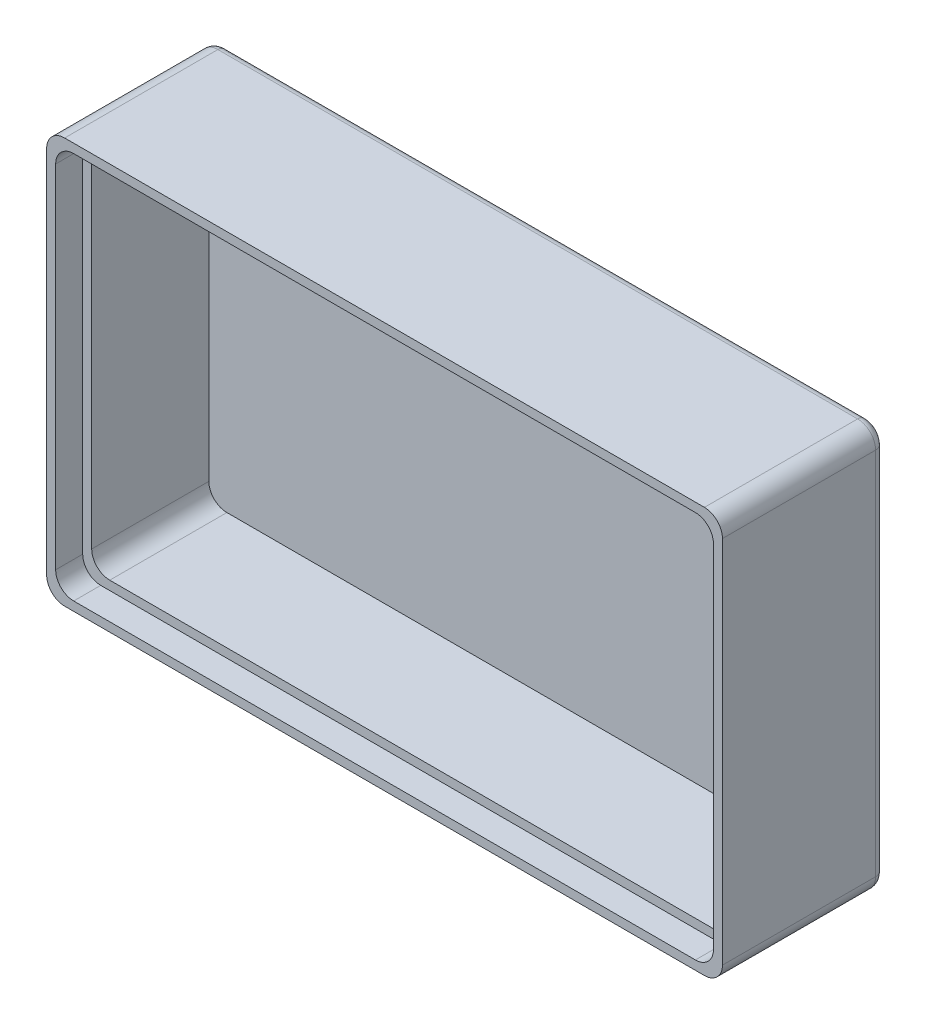
ISO-10303-21;
HEADER;
FILE_DESCRIPTION(('STEP AP214'),'2;1');
FILE_NAME('part.step','',(''),(''),'','','');
FILE_SCHEMA(('AUTOMOTIVE_DESIGN { 1 0 10303 214 1 1 1 1 }'));
ENDSEC;
DATA;
#1=APPLICATION_CONTEXT('core data for automotive mechanical design processes');
#2=APPLICATION_PROTOCOL_DEFINITION('international standard','automotive_design',2000,#1);
#3=PRODUCT_CONTEXT('',#1,'mechanical');
#4=PRODUCT('Part','Part','',(#3));
#5=PRODUCT_RELATED_PRODUCT_CATEGORY('part','',(#4));
#6=PRODUCT_DEFINITION_FORMATION('','',#4);
#7=PRODUCT_DEFINITION_CONTEXT('part definition',#1,'design');
#8=PRODUCT_DEFINITION('design','',#6,#7);
#9=PRODUCT_DEFINITION_SHAPE('','',#8);
#10=(LENGTH_UNIT() NAMED_UNIT(*) SI_UNIT(.MILLI.,.METRE.));
#11=(NAMED_UNIT(*) PLANE_ANGLE_UNIT() SI_UNIT($,.RADIAN.));
#12=(NAMED_UNIT(*) SI_UNIT($,.STERADIAN.) SOLID_ANGLE_UNIT());
#13=UNCERTAINTY_MEASURE_WITH_UNIT(LENGTH_MEASURE(1.E-05),#10,'distance_accuracy_value','');
#14=(GEOMETRIC_REPRESENTATION_CONTEXT(3) GLOBAL_UNCERTAINTY_ASSIGNED_CONTEXT((#13)) GLOBAL_UNIT_ASSIGNED_CONTEXT((#10,
#11,#12)) REPRESENTATION_CONTEXT('',''));
#15=CARTESIAN_POINT('',(0.,0.,0.));
#16=DIRECTION('',(0.,0.,1.));
#17=DIRECTION('',(1.,0.,0.));
#18=AXIS2_PLACEMENT_3D('',#15,#16,#17);
#19=CARTESIAN_POINT('',(-37.5,22.5,18.));
#20=DIRECTION('',(1.,0.,0.));
#21=DIRECTION('',(0.,1.,0.));
#22=AXIS2_PLACEMENT_3D('',#19,#20,#21);
#23=PLANE('',#22);
#24=DIRECTION('',(0.,0.,-1.));
#25=VECTOR('',#24,1.);
#26=CARTESIAN_POINT('',(-37.5,20.5,18.));
#27=LINE('',#26,#25);
#28=CARTESIAN_POINT('',(-37.5,20.5,18.));
#29=VERTEX_POINT('',#28);
#30=CARTESIAN_POINT('',(-37.5,20.5,1.));
#31=VERTEX_POINT('',#30);
#32=EDGE_CURVE('E365',#29,#31,#27,.T.);
#33=ORIENTED_EDGE('',*,*,#32,.T.);
#34=DIRECTION('',(0.,-1.,0.));
#35=VECTOR('',#34,1.);
#36=CARTESIAN_POINT('',(-37.5,22.5,1.));
#37=LINE('',#36,#35);
#38=CARTESIAN_POINT('',(-37.5,-20.5,1.));
#39=VERTEX_POINT('',#38);
#40=EDGE_CURVE('E62',#31,#39,#37,.T.);
#41=ORIENTED_EDGE('',*,*,#40,.T.);
#42=DIRECTION('',(0.,0.,-1.));
#43=VECTOR('',#42,1.);
#44=CARTESIAN_POINT('',(-37.5,-20.5,18.));
#45=LINE('',#44,#43);
#46=CARTESIAN_POINT('',(-37.5,-20.5,18.));
#47=VERTEX_POINT('',#46);
#48=EDGE_CURVE('E367',#39,#47,#45,.F.);
#49=ORIENTED_EDGE('',*,*,#48,.T.);
#50=DIRECTION('',(0.,-1.,0.));
#51=VECTOR('',#50,1.);
#52=CARTESIAN_POINT('',(-37.5,22.5,18.));
#53=LINE('',#52,#51);
#54=EDGE_CURVE('E299',#29,#47,#53,.T.);
#55=ORIENTED_EDGE('',*,*,#54,.F.);
#56=EDGE_LOOP('',(#33,#41,#49,#55));
#57=FACE_BOUND('',#56,.T.);
#58=ADVANCED_FACE('F38',(#57),#23,.F.);
#59=CARTESIAN_POINT('',(-37.5,-22.5,18.));
#60=DIRECTION('',(0.,1.,0.));
#61=DIRECTION('',(0.,0.,1.));
#62=AXIS2_PLACEMENT_3D('',#59,#60,#61);
#63=PLANE('',#62);
#64=DIRECTION('',(0.,0.,-1.));
#65=VECTOR('',#64,1.);
#66=CARTESIAN_POINT('',(-35.5,-22.5,18.));
#67=LINE('',#66,#65);
#68=CARTESIAN_POINT('',(-35.5,-22.5,18.));
#69=VERTEX_POINT('',#68);
#70=CARTESIAN_POINT('',(-35.5,-22.5,1.));
#71=VERTEX_POINT('',#70);
#72=EDGE_CURVE('E363',#69,#71,#67,.T.);
#73=ORIENTED_EDGE('',*,*,#72,.T.);
#74=DIRECTION('',(1.,0.,0.));
#75=VECTOR('',#74,1.);
#76=CARTESIAN_POINT('',(-37.5,-22.5,1.));
#77=LINE('',#76,#75);
#78=CARTESIAN_POINT('',(35.5,-22.5,1.));
#79=VERTEX_POINT('',#78);
#80=EDGE_CURVE('E11',#71,#79,#77,.T.);
#81=ORIENTED_EDGE('',*,*,#80,.T.);
#82=DIRECTION('',(0.,0.,-1.));
#83=VECTOR('',#82,1.);
#84=CARTESIAN_POINT('',(35.5,-22.5,18.));
#85=LINE('',#84,#83);
#86=CARTESIAN_POINT('',(35.5,-22.5,18.));
#87=VERTEX_POINT('',#86);
#88=EDGE_CURVE('E361',#79,#87,#85,.F.);
#89=ORIENTED_EDGE('',*,*,#88,.T.);
#90=DIRECTION('',(1.,0.,0.));
#91=VECTOR('',#90,1.);
#92=CARTESIAN_POINT('',(-37.5,-22.5,18.));
#93=LINE('',#92,#91);
#94=EDGE_CURVE('E302',#69,#87,#93,.T.);
#95=ORIENTED_EDGE('',*,*,#94,.F.);
#96=EDGE_LOOP('',(#73,#81,#89,#95));
#97=FACE_BOUND('',#96,.T.);
#98=ADVANCED_FACE('F468',(#97),#63,.F.);
#99=CARTESIAN_POINT('',(37.5,22.5,18.));
#100=DIRECTION('',(-1.,0.,0.));
#101=DIRECTION('',(0.,-1.,0.));
#102=AXIS2_PLACEMENT_3D('',#99,#100,#101);
#103=PLANE('',#102);
#104=DIRECTION('',(0.,0.,-1.));
#105=VECTOR('',#104,1.);
#106=CARTESIAN_POINT('',(37.5,-20.5,18.));
#107=LINE('',#106,#105);
#108=CARTESIAN_POINT('',(37.5,-20.5,18.));
#109=VERTEX_POINT('',#108);
#110=CARTESIAN_POINT('',(37.5,-20.5,1.));
#111=VERTEX_POINT('',#110);
#112=EDGE_CURVE('E379',#109,#111,#107,.T.);
#113=ORIENTED_EDGE('',*,*,#112,.T.);
#114=DIRECTION('',(0.,1.,0.));
#115=VECTOR('',#114,1.);
#116=CARTESIAN_POINT('',(37.5,22.5,1.));
#117=LINE('',#116,#115);
#118=CARTESIAN_POINT('',(37.5,20.5,1.));
#119=VERTEX_POINT('',#118);
#120=EDGE_CURVE('E418',#111,#119,#117,.T.);
#121=ORIENTED_EDGE('',*,*,#120,.T.);
#122=DIRECTION('',(0.,0.,-1.));
#123=VECTOR('',#122,1.);
#124=CARTESIAN_POINT('',(37.5,20.5,18.));
#125=LINE('',#124,#123);
#126=CARTESIAN_POINT('',(37.5,20.5,18.));
#127=VERTEX_POINT('',#126);
#128=EDGE_CURVE('E377',#119,#127,#125,.F.);
#129=ORIENTED_EDGE('',*,*,#128,.T.);
#130=DIRECTION('',(0.,1.,0.));
#131=VECTOR('',#130,1.);
#132=CARTESIAN_POINT('',(37.5,22.5,18.));
#133=LINE('',#132,#131);
#134=EDGE_CURVE('E305',#109,#127,#133,.T.);
#135=ORIENTED_EDGE('',*,*,#134,.F.);
#136=EDGE_LOOP('',(#113,#121,#129,#135));
#137=FACE_BOUND('',#136,.T.);
#138=ADVANCED_FACE('F486',(#137),#103,.F.);
#139=CARTESIAN_POINT('',(-37.5,22.5,18.));
#140=DIRECTION('',(0.,-1.,0.));
#141=DIRECTION('',(0.,0.,-1.));
#142=AXIS2_PLACEMENT_3D('',#139,#140,#141);
#143=PLANE('',#142);
#144=DIRECTION('',(0.,0.,-1.));
#145=VECTOR('',#144,1.);
#146=CARTESIAN_POINT('',(35.5,22.5,18.));
#147=LINE('',#146,#145);
#148=CARTESIAN_POINT('',(35.5,22.5,18.));
#149=VERTEX_POINT('',#148);
#150=CARTESIAN_POINT('',(35.5,22.5,1.));
#151=VERTEX_POINT('',#150);
#152=EDGE_CURVE('E236',#149,#151,#147,.T.);
#153=ORIENTED_EDGE('',*,*,#152,.T.);
#154=DIRECTION('',(-1.,0.,0.));
#155=VECTOR('',#154,1.);
#156=CARTESIAN_POINT('',(-37.5,22.5,1.));
#157=LINE('',#156,#155);
#158=CARTESIAN_POINT('',(-35.5,22.5,1.));
#159=VERTEX_POINT('',#158);
#160=EDGE_CURVE('E422',#151,#159,#157,.T.);
#161=ORIENTED_EDGE('',*,*,#160,.T.);
#162=DIRECTION('',(0.,0.,-1.));
#163=VECTOR('',#162,1.);
#164=CARTESIAN_POINT('',(-35.5,22.5,18.));
#165=LINE('',#164,#163);
#166=CARTESIAN_POINT('',(-35.5,22.5,18.));
#167=VERTEX_POINT('',#166);
#168=EDGE_CURVE('E382',#159,#167,#165,.F.);
#169=ORIENTED_EDGE('',*,*,#168,.T.);
#170=DIRECTION('',(-1.,0.,0.));
#171=VECTOR('',#170,1.);
#172=CARTESIAN_POINT('',(-37.5,22.5,18.));
#173=LINE('',#172,#171);
#174=EDGE_CURVE('E308',#149,#167,#173,.T.);
#175=ORIENTED_EDGE('',*,*,#174,.F.);
#176=EDGE_LOOP('',(#153,#161,#169,#175));
#177=FACE_BOUND('',#176,.T.);
#178=ADVANCED_FACE('F501',(#177),#143,.F.);
#179=CARTESIAN_POINT('',(0.,0.,18.));
#180=DIRECTION('',(0.,0.,1.));
#181=DIRECTION('',(1.,0.,0.));
#182=AXIS2_PLACEMENT_3D('',#179,#180,#181);
#183=PLANE('',#182);
#184=DIRECTION('',(0.,-1.,0.));
#185=VECTOR('',#184,1.);
#186=CARTESIAN_POINT('',(-36.5,21.5,18.));
#187=LINE('',#186,#185);
#188=CARTESIAN_POINT('',(-36.5,19.5,18.));
#189=VERTEX_POINT('',#188);
#190=CARTESIAN_POINT('',(-36.5,-19.5,18.));
#191=VERTEX_POINT('',#190);
#192=EDGE_CURVE('E265',#189,#191,#187,.T.);
#193=ORIENTED_EDGE('',*,*,#192,.F.);
#194=CARTESIAN_POINT('',(-34.5,19.5,18.));
#195=DIRECTION('',(0.,0.,1.));
#196=DIRECTION('',(1.,0.,0.));
#197=AXIS2_PLACEMENT_3D('',#194,#195,#196);
#198=CIRCLE('',#197,2.);
#199=CARTESIAN_POINT('',(-34.5,21.5,18.));
#200=VERTEX_POINT('',#199);
#201=EDGE_CURVE('E396',#189,#200,#198,.F.);
#202=ORIENTED_EDGE('',*,*,#201,.T.);
#203=DIRECTION('',(-1.,0.,0.));
#204=VECTOR('',#203,1.);
#205=CARTESIAN_POINT('',(36.5,21.5,18.));
#206=LINE('',#205,#204);
#207=CARTESIAN_POINT('',(34.5,21.5,18.));
#208=VERTEX_POINT('',#207);
#209=EDGE_CURVE('E270',#208,#200,#206,.T.);
#210=ORIENTED_EDGE('',*,*,#209,.F.);
#211=CARTESIAN_POINT('',(34.5,19.5,18.));
#212=DIRECTION('',(0.,0.,1.));
#213=DIRECTION('',(1.,0.,0.));
#214=AXIS2_PLACEMENT_3D('',#211,#212,#213);
#215=CIRCLE('',#214,2.);
#216=CARTESIAN_POINT('',(36.5,19.5,18.));
#217=VERTEX_POINT('',#216);
#218=EDGE_CURVE('E394',#208,#217,#215,.F.);
#219=ORIENTED_EDGE('',*,*,#218,.T.);
#220=DIRECTION('',(0.,1.,0.));
#221=VECTOR('',#220,1.);
#222=CARTESIAN_POINT('',(36.5,-21.5,18.));
#223=LINE('',#222,#221);
#224=CARTESIAN_POINT('',(36.5,-19.5,18.));
#225=VERTEX_POINT('',#224);
#226=EDGE_CURVE('E285',#225,#217,#223,.T.);
#227=ORIENTED_EDGE('',*,*,#226,.F.);
#228=CARTESIAN_POINT('',(34.5,-19.5,18.));
#229=DIRECTION('',(0.,0.,1.));
#230=DIRECTION('',(1.,0.,0.));
#231=AXIS2_PLACEMENT_3D('',#228,#229,#230);
#232=CIRCLE('',#231,2.);
#233=CARTESIAN_POINT('',(34.5,-21.5,18.));
#234=VERTEX_POINT('',#233);
#235=EDGE_CURVE('E392',#225,#234,#232,.F.);
#236=ORIENTED_EDGE('',*,*,#235,.T.);
#237=DIRECTION('',(1.,0.,0.));
#238=VECTOR('',#237,1.);
#239=CARTESIAN_POINT('',(-36.5,-21.5,18.));
#240=LINE('',#239,#238);
#241=CARTESIAN_POINT('',(-34.5,-21.5,18.));
#242=VERTEX_POINT('',#241);
#243=EDGE_CURVE('E282',#242,#234,#240,.T.);
#244=ORIENTED_EDGE('',*,*,#243,.F.);
#245=CARTESIAN_POINT('',(-34.5,-19.5,18.));
#246=DIRECTION('',(0.,0.,1.));
#247=DIRECTION('',(1.,0.,0.));
#248=AXIS2_PLACEMENT_3D('',#245,#246,#247);
#249=CIRCLE('',#248,2.);
#250=EDGE_CURVE('E390',#242,#191,#249,.F.);
#251=ORIENTED_EDGE('',*,*,#250,.T.);
#252=EDGE_LOOP('',(#193,#202,#210,#219,#227,#236,#244,#251));
#253=FACE_BOUND('',#252,.T.);
#254=ORIENTED_EDGE('',*,*,#54,.T.);
#255=CARTESIAN_POINT('',(-35.5,-20.5,18.));
#256=DIRECTION('',(0.,0.,1.));
#257=DIRECTION('',(1.,0.,0.));
#258=AXIS2_PLACEMENT_3D('',#255,#256,#257);
#259=CIRCLE('',#258,2.);
#260=EDGE_CURVE('E375',#47,#69,#259,.T.);
#261=ORIENTED_EDGE('',*,*,#260,.T.);
#262=ORIENTED_EDGE('',*,*,#94,.T.);
#263=CARTESIAN_POINT('',(35.5,-20.5,18.));
#264=DIRECTION('',(0.,0.,1.));
#265=DIRECTION('',(1.,0.,0.));
#266=AXIS2_PLACEMENT_3D('',#263,#264,#265);
#267=CIRCLE('',#266,2.);
#268=EDGE_CURVE('E373',#87,#109,#267,.T.);
#269=ORIENTED_EDGE('',*,*,#268,.T.);
#270=ORIENTED_EDGE('',*,*,#134,.T.);
#271=CARTESIAN_POINT('',(35.5,20.5,18.));
#272=DIRECTION('',(0.,0.,1.));
#273=DIRECTION('',(1.,0.,0.));
#274=AXIS2_PLACEMENT_3D('',#271,#272,#273);
#275=CIRCLE('',#274,2.);
#276=EDGE_CURVE('E371',#127,#149,#275,.T.);
#277=ORIENTED_EDGE('',*,*,#276,.T.);
#278=ORIENTED_EDGE('',*,*,#174,.T.);
#279=CARTESIAN_POINT('',(-35.5,20.5,18.));
#280=DIRECTION('',(0.,0.,1.));
#281=DIRECTION('',(1.,0.,0.));
#282=AXIS2_PLACEMENT_3D('',#279,#280,#281);
#283=CIRCLE('',#282,2.);
#284=EDGE_CURVE('E369',#167,#29,#283,.T.);
#285=ORIENTED_EDGE('',*,*,#284,.T.);
#286=EDGE_LOOP('',(#254,#261,#262,#269,#270,#277,#278,#285));
#287=FACE_BOUND('',#286,.T.);
#288=ADVANCED_FACE('F509',(#253,#287),#183,.T.);
#289=CARTESIAN_POINT('',(0.,0.,0.));
#290=DIRECTION('',(0.,0.,1.));
#291=DIRECTION('',(1.,0.,0.));
#292=AXIS2_PLACEMENT_3D('',#289,#290,#291);
#293=PLANE('',#292);
#294=DIRECTION('',(0.,1.,0.));
#295=VECTOR('',#294,1.);
#296=CARTESIAN_POINT('',(36.5,0.,0.));
#297=LINE('',#296,#295);
#298=CARTESIAN_POINT('',(36.5,20.5,0.));
#299=VERTEX_POINT('',#298);
#300=CARTESIAN_POINT('',(36.5,-20.5,0.));
#301=VERTEX_POINT('',#300);
#302=EDGE_CURVE('E410',#299,#301,#297,.F.);
#303=ORIENTED_EDGE('',*,*,#302,.T.);
#304=CARTESIAN_POINT('',(35.5,-20.5,0.));
#305=DIRECTION('',(0.,0.,1.));
#306=DIRECTION('',(1.,0.,0.));
#307=AXIS2_PLACEMENT_3D('',#304,#305,#306);
#308=CIRCLE('',#307,1.);
#309=CARTESIAN_POINT('',(35.5,-21.5,0.));
#310=VERTEX_POINT('',#309);
#311=EDGE_CURVE('E412',#301,#310,#308,.F.);
#312=ORIENTED_EDGE('',*,*,#311,.T.);
#313=DIRECTION('',(1.,0.,0.));
#314=VECTOR('',#313,1.);
#315=CARTESIAN_POINT('',(0.,-21.5,0.));
#316=LINE('',#315,#314);
#317=CARTESIAN_POINT('',(-35.5,-21.5,0.));
#318=VERTEX_POINT('',#317);
#319=EDGE_CURVE('E398',#310,#318,#316,.F.);
#320=ORIENTED_EDGE('',*,*,#319,.T.);
#321=CARTESIAN_POINT('',(-35.5,-20.5,0.));
#322=DIRECTION('',(0.,0.,1.));
#323=DIRECTION('',(1.,0.,0.));
#324=AXIS2_PLACEMENT_3D('',#321,#322,#323);
#325=CIRCLE('',#324,1.);
#326=CARTESIAN_POINT('',(-36.5,-20.5,0.));
#327=VERTEX_POINT('',#326);
#328=EDGE_CURVE('E400',#318,#327,#325,.F.);
#329=ORIENTED_EDGE('',*,*,#328,.T.);
#330=DIRECTION('',(0.,-1.,0.));
#331=VECTOR('',#330,1.);
#332=CARTESIAN_POINT('',(-36.5,0.,0.));
#333=LINE('',#332,#331);
#334=CARTESIAN_POINT('',(-36.5,20.5,0.));
#335=VERTEX_POINT('',#334);
#336=EDGE_CURVE('E402',#327,#335,#333,.F.);
#337=ORIENTED_EDGE('',*,*,#336,.T.);
#338=CARTESIAN_POINT('',(-35.5,20.5,0.));
#339=DIRECTION('',(0.,0.,1.));
#340=DIRECTION('',(1.,0.,0.));
#341=AXIS2_PLACEMENT_3D('',#338,#339,#340);
#342=CIRCLE('',#341,1.);
#343=CARTESIAN_POINT('',(-35.5,21.5,0.));
#344=VERTEX_POINT('',#343);
#345=EDGE_CURVE('E404',#335,#344,#342,.F.);
#346=ORIENTED_EDGE('',*,*,#345,.T.);
#347=DIRECTION('',(-1.,0.,0.));
#348=VECTOR('',#347,1.);
#349=CARTESIAN_POINT('',(0.,21.5,0.));
#350=LINE('',#349,#348);
#351=CARTESIAN_POINT('',(35.5,21.5,0.));
#352=VERTEX_POINT('',#351);
#353=EDGE_CURVE('E406',#344,#352,#350,.F.);
#354=ORIENTED_EDGE('',*,*,#353,.T.);
#355=CARTESIAN_POINT('',(35.5,20.5,0.));
#356=DIRECTION('',(0.,0.,1.));
#357=DIRECTION('',(1.,0.,0.));
#358=AXIS2_PLACEMENT_3D('',#355,#356,#357);
#359=CIRCLE('',#358,1.);
#360=EDGE_CURVE('E408',#352,#299,#359,.F.);
#361=ORIENTED_EDGE('',*,*,#360,.T.);
#362=EDGE_LOOP('',(#303,#312,#320,#329,#337,#346,#354,#361));
#363=FACE_BOUND('',#362,.T.);
#364=ADVANCED_FACE('F455',(#363),#293,.F.);
#365=CARTESIAN_POINT('',(-36.5,21.5,15.));
#366=DIRECTION('',(-1.,0.,0.));
#367=DIRECTION('',(0.,0.,1.));
#368=AXIS2_PLACEMENT_3D('',#365,#366,#367);
#369=PLANE('',#368);
#370=ORIENTED_EDGE('',*,*,#192,.T.);
#371=DIRECTION('',(0.,0.,1.));
#372=VECTOR('',#371,1.);
#373=CARTESIAN_POINT('',(-36.5,-19.5,15.));
#374=LINE('',#373,#372);
#375=CARTESIAN_POINT('',(-36.5,-19.5,15.));
#376=VERTEX_POINT('',#375);
#377=EDGE_CURVE('E341',#191,#376,#374,.F.);
#378=ORIENTED_EDGE('',*,*,#377,.T.);
#379=DIRECTION('',(0.,-1.,0.));
#380=VECTOR('',#379,1.);
#381=CARTESIAN_POINT('',(-36.5,21.5,15.));
#382=LINE('',#381,#380);
#383=CARTESIAN_POINT('',(-36.5,19.5,15.));
#384=VERTEX_POINT('',#383);
#385=EDGE_CURVE('E266',#384,#376,#382,.T.);
#386=ORIENTED_EDGE('',*,*,#385,.F.);
#387=DIRECTION('',(0.,0.,1.));
#388=VECTOR('',#387,1.);
#389=CARTESIAN_POINT('',(-36.5,19.5,18.));
#390=LINE('',#389,#388);
#391=EDGE_CURVE('E338',#384,#189,#390,.T.);
#392=ORIENTED_EDGE('',*,*,#391,.T.);
#393=EDGE_LOOP('',(#370,#378,#386,#392));
#394=FACE_BOUND('',#393,.T.);
#395=ADVANCED_FACE('F572',(#394),#369,.F.);
#396=CARTESIAN_POINT('',(36.5,21.5,15.));
#397=DIRECTION('',(0.,1.,0.));
#398=DIRECTION('',(0.,0.,1.));
#399=AXIS2_PLACEMENT_3D('',#396,#397,#398);
#400=PLANE('',#399);
#401=DIRECTION('',(-1.,0.,0.));
#402=VECTOR('',#401,1.);
#403=CARTESIAN_POINT('',(36.5,21.5,15.));
#404=LINE('',#403,#402);
#405=CARTESIAN_POINT('',(34.5,21.5,15.));
#406=VERTEX_POINT('',#405);
#407=CARTESIAN_POINT('',(-34.5,21.5,15.));
#408=VERTEX_POINT('',#407);
#409=EDGE_CURVE('E276',#406,#408,#404,.T.);
#410=ORIENTED_EDGE('',*,*,#409,.F.);
#411=DIRECTION('',(0.,0.,1.));
#412=VECTOR('',#411,1.);
#413=CARTESIAN_POINT('',(34.5,21.5,18.));
#414=LINE('',#413,#412);
#415=EDGE_CURVE('E358',#406,#208,#414,.T.);
#416=ORIENTED_EDGE('',*,*,#415,.T.);
#417=ORIENTED_EDGE('',*,*,#209,.T.);
#418=DIRECTION('',(0.,0.,1.));
#419=VECTOR('',#418,1.);
#420=CARTESIAN_POINT('',(-34.5,21.5,15.));
#421=LINE('',#420,#419);
#422=EDGE_CURVE('E356',#200,#408,#421,.F.);
#423=ORIENTED_EDGE('',*,*,#422,.T.);
#424=EDGE_LOOP('',(#410,#416,#417,#423));
#425=FACE_BOUND('',#424,.T.);
#426=ADVANCED_FACE('F565',(#425),#400,.F.);
#427=CARTESIAN_POINT('',(36.5,-21.5,15.));
#428=DIRECTION('',(1.,0.,0.));
#429=DIRECTION('',(0.,0.,-1.));
#430=AXIS2_PLACEMENT_3D('',#427,#428,#429);
#431=PLANE('',#430);
#432=DIRECTION('',(0.,1.,0.));
#433=VECTOR('',#432,1.);
#434=CARTESIAN_POINT('',(36.5,-21.5,15.));
#435=LINE('',#434,#433);
#436=CARTESIAN_POINT('',(36.5,-19.5,15.));
#437=VERTEX_POINT('',#436);
#438=CARTESIAN_POINT('',(36.5,19.5,15.));
#439=VERTEX_POINT('',#438);
#440=EDGE_CURVE('E273',#437,#439,#435,.T.);
#441=ORIENTED_EDGE('',*,*,#440,.F.);
#442=DIRECTION('',(0.,0.,1.));
#443=VECTOR('',#442,1.);
#444=CARTESIAN_POINT('',(36.5,-19.5,18.));
#445=LINE('',#444,#443);
#446=EDGE_CURVE('E353',#437,#225,#445,.T.);
#447=ORIENTED_EDGE('',*,*,#446,.T.);
#448=ORIENTED_EDGE('',*,*,#226,.T.);
#449=DIRECTION('',(0.,0.,1.));
#450=VECTOR('',#449,1.);
#451=CARTESIAN_POINT('',(36.5,19.5,15.));
#452=LINE('',#451,#450);
#453=EDGE_CURVE('E351',#217,#439,#452,.F.);
#454=ORIENTED_EDGE('',*,*,#453,.T.);
#455=EDGE_LOOP('',(#441,#447,#448,#454));
#456=FACE_BOUND('',#455,.T.);
#457=ADVANCED_FACE('F584',(#456),#431,.F.);
#458=CARTESIAN_POINT('',(-36.5,-21.5,15.));
#459=DIRECTION('',(0.,-1.,0.));
#460=DIRECTION('',(0.,0.,-1.));
#461=AXIS2_PLACEMENT_3D('',#458,#459,#460);
#462=PLANE('',#461);
#463=DIRECTION('',(1.,0.,0.));
#464=VECTOR('',#463,1.);
#465=CARTESIAN_POINT('',(-36.5,-21.5,15.));
#466=LINE('',#465,#464);
#467=CARTESIAN_POINT('',(-34.5,-21.5,15.));
#468=VERTEX_POINT('',#467);
#469=CARTESIAN_POINT('',(34.5,-21.5,15.));
#470=VERTEX_POINT('',#469);
#471=EDGE_CURVE('E269',#468,#470,#466,.T.);
#472=ORIENTED_EDGE('',*,*,#471,.F.);
#473=DIRECTION('',(0.,0.,1.));
#474=VECTOR('',#473,1.);
#475=CARTESIAN_POINT('',(-34.5,-21.5,18.));
#476=LINE('',#475,#474);
#477=EDGE_CURVE('E335',#468,#242,#476,.T.);
#478=ORIENTED_EDGE('',*,*,#477,.T.);
#479=ORIENTED_EDGE('',*,*,#243,.T.);
#480=DIRECTION('',(0.,0.,1.));
#481=VECTOR('',#480,1.);
#482=CARTESIAN_POINT('',(34.5,-21.5,15.));
#483=LINE('',#482,#481);
#484=EDGE_CURVE('E333',#234,#470,#483,.F.);
#485=ORIENTED_EDGE('',*,*,#484,.T.);
#486=EDGE_LOOP('',(#472,#478,#479,#485));
#487=FACE_BOUND('',#486,.T.);
#488=ADVANCED_FACE('F579',(#487),#462,.F.);
#489=CARTESIAN_POINT('',(0.,0.,15.));
#490=DIRECTION('',(0.,0.,1.));
#491=DIRECTION('',(1.,0.,0.));
#492=AXIS2_PLACEMENT_3D('',#489,#490,#491);
#493=PLANE('',#492);
#494=DIRECTION('',(-1.,0.,0.));
#495=VECTOR('',#494,1.);
#496=CARTESIAN_POINT('',(35.5,20.5,15.));
#497=LINE('',#496,#495);
#498=CARTESIAN_POINT('',(33.5,20.5,15.));
#499=VERTEX_POINT('',#498);
#500=CARTESIAN_POINT('',(-33.5,20.5,15.));
#501=VERTEX_POINT('',#500);
#502=EDGE_CURVE('E263',#499,#501,#497,.T.);
#503=ORIENTED_EDGE('',*,*,#502,.F.);
#504=CARTESIAN_POINT('',(33.5,18.5,15.));
#505=DIRECTION('',(0.,0.,1.));
#506=DIRECTION('',(1.,0.,0.));
#507=AXIS2_PLACEMENT_3D('',#504,#505,#506);
#508=CIRCLE('',#507,2.);
#509=CARTESIAN_POINT('',(35.5,18.5,15.));
#510=VERTEX_POINT('',#509);
#511=EDGE_CURVE('E235',#499,#510,#508,.F.);
#512=ORIENTED_EDGE('',*,*,#511,.T.);
#513=DIRECTION('',(0.,1.,0.));
#514=VECTOR('',#513,1.);
#515=CARTESIAN_POINT('',(35.5,-20.5,15.));
#516=LINE('',#515,#514);
#517=CARTESIAN_POINT('',(35.5,-18.5,15.));
#518=VERTEX_POINT('',#517);
#519=EDGE_CURVE('E256',#518,#510,#516,.T.);
#520=ORIENTED_EDGE('',*,*,#519,.F.);
#521=CARTESIAN_POINT('',(33.5,-18.5,15.));
#522=DIRECTION('',(0.,0.,1.));
#523=DIRECTION('',(1.,0.,0.));
#524=AXIS2_PLACEMENT_3D('',#521,#522,#523);
#525=CIRCLE('',#524,2.);
#526=CARTESIAN_POINT('',(33.5,-20.5,15.));
#527=VERTEX_POINT('',#526);
#528=EDGE_CURVE('E387',#518,#527,#525,.F.);
#529=ORIENTED_EDGE('',*,*,#528,.T.);
#530=DIRECTION('',(1.,0.,0.));
#531=VECTOR('',#530,1.);
#532=CARTESIAN_POINT('',(-35.5,-20.5,15.));
#533=LINE('',#532,#531);
#534=CARTESIAN_POINT('',(-33.5,-20.5,15.));
#535=VERTEX_POINT('',#534);
#536=EDGE_CURVE('E253',#535,#527,#533,.T.);
#537=ORIENTED_EDGE('',*,*,#536,.F.);
#538=CARTESIAN_POINT('',(-33.5,-18.5,15.));
#539=DIRECTION('',(0.,0.,1.));
#540=DIRECTION('',(1.,0.,0.));
#541=AXIS2_PLACEMENT_3D('',#538,#539,#540);
#542=CIRCLE('',#541,2.);
#543=CARTESIAN_POINT('',(-35.5,-18.5,15.));
#544=VERTEX_POINT('',#543);
#545=EDGE_CURVE('E252',#535,#544,#542,.F.);
#546=ORIENTED_EDGE('',*,*,#545,.T.);
#547=DIRECTION('',(0.,-1.,0.));
#548=VECTOR('',#547,1.);
#549=CARTESIAN_POINT('',(-35.5,20.5,15.));
#550=LINE('',#549,#548);
#551=CARTESIAN_POINT('',(-35.5,18.5,15.));
#552=VERTEX_POINT('',#551);
#553=EDGE_CURVE('E242',#552,#544,#550,.T.);
#554=ORIENTED_EDGE('',*,*,#553,.F.);
#555=CARTESIAN_POINT('',(-33.5,18.5,15.));
#556=DIRECTION('',(0.,0.,1.));
#557=DIRECTION('',(1.,0.,0.));
#558=AXIS2_PLACEMENT_3D('',#555,#556,#557);
#559=CIRCLE('',#558,2.);
#560=EDGE_CURVE('E225',#552,#501,#559,.F.);
#561=ORIENTED_EDGE('',*,*,#560,.T.);
#562=EDGE_LOOP('',(#503,#512,#520,#529,#537,#546,#554,#561));
#563=FACE_BOUND('',#562,.T.);
#564=ORIENTED_EDGE('',*,*,#385,.T.);
#565=CARTESIAN_POINT('',(-34.5,-19.5,15.));
#566=DIRECTION('',(0.,0.,1.));
#567=DIRECTION('',(1.,0.,0.));
#568=AXIS2_PLACEMENT_3D('',#565,#566,#567);
#569=CIRCLE('',#568,2.);
#570=EDGE_CURVE('E349',#376,#468,#569,.T.);
#571=ORIENTED_EDGE('',*,*,#570,.T.);
#572=ORIENTED_EDGE('',*,*,#471,.T.);
#573=CARTESIAN_POINT('',(34.5,-19.5,15.));
#574=DIRECTION('',(0.,0.,1.));
#575=DIRECTION('',(1.,0.,0.));
#576=AXIS2_PLACEMENT_3D('',#573,#574,#575);
#577=CIRCLE('',#576,2.);
#578=EDGE_CURVE('E347',#470,#437,#577,.T.);
#579=ORIENTED_EDGE('',*,*,#578,.T.);
#580=ORIENTED_EDGE('',*,*,#440,.T.);
#581=CARTESIAN_POINT('',(34.5,19.5,15.));
#582=DIRECTION('',(0.,0.,1.));
#583=DIRECTION('',(1.,0.,0.));
#584=AXIS2_PLACEMENT_3D('',#581,#582,#583);
#585=CIRCLE('',#584,2.);
#586=EDGE_CURVE('E345',#439,#406,#585,.T.);
#587=ORIENTED_EDGE('',*,*,#586,.T.);
#588=ORIENTED_EDGE('',*,*,#409,.T.);
#589=CARTESIAN_POINT('',(-34.5,19.5,15.));
#590=DIRECTION('',(0.,0.,1.));
#591=DIRECTION('',(1.,0.,0.));
#592=AXIS2_PLACEMENT_3D('',#589,#590,#591);
#593=CIRCLE('',#592,2.);
#594=EDGE_CURVE('E343',#408,#384,#593,.T.);
#595=ORIENTED_EDGE('',*,*,#594,.T.);
#596=EDGE_LOOP('',(#564,#571,#572,#579,#580,#587,#588,#595));
#597=FACE_BOUND('',#596,.T.);
#598=ADVANCED_FACE('F249',(#563,#597),#493,.T.);
#599=CARTESIAN_POINT('',(0.,0.,2.));
#600=DIRECTION('',(0.,0.,1.));
#601=DIRECTION('',(1.,0.,0.));
#602=AXIS2_PLACEMENT_3D('',#599,#600,#601);
#603=PLANE('',#602);
#604=DIRECTION('',(-1.,0.,0.));
#605=VECTOR('',#604,1.);
#606=CARTESIAN_POINT('',(35.5,20.5,2.));
#607=LINE('',#606,#605);
#608=CARTESIAN_POINT('',(33.5,20.5,2.));
#609=VERTEX_POINT('',#608);
#610=CARTESIAN_POINT('',(-33.5,20.5,2.));
#611=VERTEX_POINT('',#610);
#612=EDGE_CURVE('E279',#609,#611,#607,.T.);
#613=ORIENTED_EDGE('',*,*,#612,.T.);
#614=CARTESIAN_POINT('',(-33.5,18.5,2.));
#615=DIRECTION('',(0.,0.,1.));
#616=DIRECTION('',(1.,0.,0.));
#617=AXIS2_PLACEMENT_3D('',#614,#615,#616);
#618=CIRCLE('',#617,2.);
#619=CARTESIAN_POINT('',(-35.5,18.5,2.));
#620=VERTEX_POINT('',#619);
#621=EDGE_CURVE('E321',#611,#620,#618,.T.);
#622=ORIENTED_EDGE('',*,*,#621,.T.);
#623=DIRECTION('',(0.,-1.,0.));
#624=VECTOR('',#623,1.);
#625=CARTESIAN_POINT('',(-35.5,20.5,2.));
#626=LINE('',#625,#624);
#627=CARTESIAN_POINT('',(-35.5,-18.5,2.));
#628=VERTEX_POINT('',#627);
#629=EDGE_CURVE('E245',#620,#628,#626,.T.);
#630=ORIENTED_EDGE('',*,*,#629,.T.);
#631=CARTESIAN_POINT('',(-33.5,-18.5,2.));
#632=DIRECTION('',(0.,0.,1.));
#633=DIRECTION('',(1.,0.,0.));
#634=AXIS2_PLACEMENT_3D('',#631,#632,#633);
#635=CIRCLE('',#634,2.);
#636=CARTESIAN_POINT('',(-33.5,-20.5,2.));
#637=VERTEX_POINT('',#636);
#638=EDGE_CURVE('E315',#628,#637,#635,.T.);
#639=ORIENTED_EDGE('',*,*,#638,.T.);
#640=DIRECTION('',(1.,0.,0.));
#641=VECTOR('',#640,1.);
#642=CARTESIAN_POINT('',(-35.5,-20.5,2.));
#643=LINE('',#642,#641);
#644=CARTESIAN_POINT('',(33.5,-20.5,2.));
#645=VERTEX_POINT('',#644);
#646=EDGE_CURVE('E293',#637,#645,#643,.T.);
#647=ORIENTED_EDGE('',*,*,#646,.T.);
#648=CARTESIAN_POINT('',(33.5,-18.5,2.));
#649=DIRECTION('',(0.,0.,1.));
#650=DIRECTION('',(1.,0.,0.));
#651=AXIS2_PLACEMENT_3D('',#648,#649,#650);
#652=CIRCLE('',#651,2.);
#653=CARTESIAN_POINT('',(35.5,-18.5,2.));
#654=VERTEX_POINT('',#653);
#655=EDGE_CURVE('E317',#645,#654,#652,.T.);
#656=ORIENTED_EDGE('',*,*,#655,.T.);
#657=DIRECTION('',(0.,1.,0.));
#658=VECTOR('',#657,1.);
#659=CARTESIAN_POINT('',(35.5,-20.5,2.));
#660=LINE('',#659,#658);
#661=CARTESIAN_POINT('',(35.5,18.5,2.));
#662=VERTEX_POINT('',#661);
#663=EDGE_CURVE('E296',#654,#662,#660,.T.);
#664=ORIENTED_EDGE('',*,*,#663,.T.);
#665=CARTESIAN_POINT('',(33.5,18.5,2.));
#666=DIRECTION('',(0.,0.,1.));
#667=DIRECTION('',(1.,0.,0.));
#668=AXIS2_PLACEMENT_3D('',#665,#666,#667);
#669=CIRCLE('',#668,2.);
#670=EDGE_CURVE('E319',#662,#609,#669,.T.);
#671=ORIENTED_EDGE('',*,*,#670,.T.);
#672=EDGE_LOOP('',(#613,#622,#630,#639,#647,#656,#664,#671));
#673=FACE_BOUND('',#672,.T.);
#674=ADVANCED_FACE('F761',(#673),#603,.T.);
#675=CARTESIAN_POINT('',(-35.5,20.5,2.));
#676=DIRECTION('',(-1.,0.,0.));
#677=DIRECTION('',(0.,0.,1.));
#678=AXIS2_PLACEMENT_3D('',#675,#676,#677);
#679=PLANE('',#678);
#680=ORIENTED_EDGE('',*,*,#629,.F.);
#681=DIRECTION('',(0.,0.,1.));
#682=VECTOR('',#681,1.);
#683=CARTESIAN_POINT('',(-35.5,18.5,15.));
#684=LINE('',#683,#682);
#685=EDGE_CURVE('E229',#620,#552,#684,.T.);
#686=ORIENTED_EDGE('',*,*,#685,.T.);
#687=ORIENTED_EDGE('',*,*,#553,.T.);
#688=DIRECTION('',(0.,0.,1.));
#689=VECTOR('',#688,1.);
#690=CARTESIAN_POINT('',(-35.5,-18.5,2.));
#691=LINE('',#690,#689);
#692=EDGE_CURVE('E247',#544,#628,#691,.F.);
#693=ORIENTED_EDGE('',*,*,#692,.T.);
#694=EDGE_LOOP('',(#680,#686,#687,#693));
#695=FACE_BOUND('',#694,.T.);
#696=ADVANCED_FACE('F241',(#695),#679,.F.);
#697=CARTESIAN_POINT('',(-35.5,-20.5,2.));
#698=DIRECTION('',(0.,-1.,0.));
#699=DIRECTION('',(0.,0.,-1.));
#700=AXIS2_PLACEMENT_3D('',#697,#698,#699);
#701=PLANE('',#700);
#702=ORIENTED_EDGE('',*,*,#536,.T.);
#703=DIRECTION('',(0.,0.,1.));
#704=VECTOR('',#703,1.);
#705=CARTESIAN_POINT('',(33.5,-20.5,2.));
#706=LINE('',#705,#704);
#707=EDGE_CURVE('E331',#527,#645,#706,.F.);
#708=ORIENTED_EDGE('',*,*,#707,.T.);
#709=ORIENTED_EDGE('',*,*,#646,.F.);
#710=DIRECTION('',(0.,0.,1.));
#711=VECTOR('',#710,1.);
#712=CARTESIAN_POINT('',(-33.5,-20.5,15.));
#713=LINE('',#712,#711);
#714=EDGE_CURVE('E328',#637,#535,#713,.T.);
#715=ORIENTED_EDGE('',*,*,#714,.T.);
#716=EDGE_LOOP('',(#702,#708,#709,#715));
#717=FACE_BOUND('',#716,.T.);
#718=ADVANCED_FACE('F804',(#717),#701,.F.);
#719=CARTESIAN_POINT('',(35.5,-20.5,2.));
#720=DIRECTION('',(1.,0.,0.));
#721=DIRECTION('',(0.,0.,-1.));
#722=AXIS2_PLACEMENT_3D('',#719,#720,#721);
#723=PLANE('',#722);
#724=ORIENTED_EDGE('',*,*,#519,.T.);
#725=DIRECTION('',(0.,0.,1.));
#726=VECTOR('',#725,1.);
#727=CARTESIAN_POINT('',(35.5,18.5,2.));
#728=LINE('',#727,#726);
#729=EDGE_CURVE('E326',#510,#662,#728,.F.);
#730=ORIENTED_EDGE('',*,*,#729,.T.);
#731=ORIENTED_EDGE('',*,*,#663,.F.);
#732=DIRECTION('',(0.,0.,1.));
#733=VECTOR('',#732,1.);
#734=CARTESIAN_POINT('',(35.5,-18.5,15.));
#735=LINE('',#734,#733);
#736=EDGE_CURVE('E323',#654,#518,#735,.T.);
#737=ORIENTED_EDGE('',*,*,#736,.T.);
#738=EDGE_LOOP('',(#724,#730,#731,#737));
#739=FACE_BOUND('',#738,.T.);
#740=ADVANCED_FACE('F796',(#739),#723,.F.);
#741=CARTESIAN_POINT('',(35.5,20.5,2.));
#742=DIRECTION('',(0.,1.,0.));
#743=DIRECTION('',(0.,0.,1.));
#744=AXIS2_PLACEMENT_3D('',#741,#742,#743);
#745=PLANE('',#744);
#746=ORIENTED_EDGE('',*,*,#502,.T.);
#747=DIRECTION('',(0.,0.,1.));
#748=VECTOR('',#747,1.);
#749=CARTESIAN_POINT('',(-33.5,20.5,2.));
#750=LINE('',#749,#748);
#751=EDGE_CURVE('E230',#501,#611,#750,.F.);
#752=ORIENTED_EDGE('',*,*,#751,.T.);
#753=ORIENTED_EDGE('',*,*,#612,.F.);
#754=DIRECTION('',(0.,0.,1.));
#755=VECTOR('',#754,1.);
#756=CARTESIAN_POINT('',(33.5,20.5,15.));
#757=LINE('',#756,#755);
#758=EDGE_CURVE('E246',#609,#499,#757,.T.);
#759=ORIENTED_EDGE('',*,*,#758,.T.);
#760=EDGE_LOOP('',(#746,#752,#753,#759));
#761=FACE_BOUND('',#760,.T.);
#762=ADVANCED_FACE('F534',(#761),#745,.F.);
#763=CARTESIAN_POINT('',(-33.5,18.5,2.));
#764=DIRECTION('',(0.,0.,-1.));
#765=DIRECTION('',(-1.,0.,0.));
#766=AXIS2_PLACEMENT_3D('',#763,#764,#765);
#767=CYLINDRICAL_SURFACE('',#766,2.);
#768=ORIENTED_EDGE('',*,*,#621,.F.);
#769=ORIENTED_EDGE('',*,*,#751,.F.);
#770=ORIENTED_EDGE('',*,*,#560,.F.);
#771=ORIENTED_EDGE('',*,*,#685,.F.);
#772=EDGE_LOOP('',(#768,#769,#770,#771));
#773=FACE_BOUND('',#772,.T.);
#774=ADVANCED_FACE('F228',(#773),#767,.F.);
#775=CARTESIAN_POINT('',(33.5,18.5,2.));
#776=DIRECTION('',(0.,0.,-1.));
#777=DIRECTION('',(-1.,0.,0.));
#778=AXIS2_PLACEMENT_3D('',#775,#776,#777);
#779=CYLINDRICAL_SURFACE('',#778,2.);
#780=ORIENTED_EDGE('',*,*,#670,.F.);
#781=ORIENTED_EDGE('',*,*,#729,.F.);
#782=ORIENTED_EDGE('',*,*,#511,.F.);
#783=ORIENTED_EDGE('',*,*,#758,.F.);
#784=EDGE_LOOP('',(#780,#781,#782,#783));
#785=FACE_BOUND('',#784,.T.);
#786=ADVANCED_FACE('F533',(#785),#779,.F.);
#787=CARTESIAN_POINT('',(33.5,-18.5,2.));
#788=DIRECTION('',(0.,0.,-1.));
#789=DIRECTION('',(-1.,0.,0.));
#790=AXIS2_PLACEMENT_3D('',#787,#788,#789);
#791=CYLINDRICAL_SURFACE('',#790,2.);
#792=ORIENTED_EDGE('',*,*,#655,.F.);
#793=ORIENTED_EDGE('',*,*,#707,.F.);
#794=ORIENTED_EDGE('',*,*,#528,.F.);
#795=ORIENTED_EDGE('',*,*,#736,.F.);
#796=EDGE_LOOP('',(#792,#793,#794,#795));
#797=FACE_BOUND('',#796,.T.);
#798=ADVANCED_FACE('F537',(#797),#791,.F.);
#799=CARTESIAN_POINT('',(-33.5,-18.5,2.));
#800=DIRECTION('',(0.,0.,-1.));
#801=DIRECTION('',(-1.,0.,0.));
#802=AXIS2_PLACEMENT_3D('',#799,#800,#801);
#803=CYLINDRICAL_SURFACE('',#802,2.);
#804=ORIENTED_EDGE('',*,*,#638,.F.);
#805=ORIENTED_EDGE('',*,*,#692,.F.);
#806=ORIENTED_EDGE('',*,*,#545,.F.);
#807=ORIENTED_EDGE('',*,*,#714,.F.);
#808=EDGE_LOOP('',(#804,#805,#806,#807));
#809=FACE_BOUND('',#808,.T.);
#810=ADVANCED_FACE('F541',(#809),#803,.F.);
#811=CARTESIAN_POINT('',(-34.5,-19.5,15.));
#812=DIRECTION('',(0.,0.,-1.));
#813=DIRECTION('',(-1.,0.,0.));
#814=AXIS2_PLACEMENT_3D('',#811,#812,#813);
#815=CYLINDRICAL_SURFACE('',#814,2.);
#816=ORIENTED_EDGE('',*,*,#570,.F.);
#817=ORIENTED_EDGE('',*,*,#377,.F.);
#818=ORIENTED_EDGE('',*,*,#250,.F.);
#819=ORIENTED_EDGE('',*,*,#477,.F.);
#820=EDGE_LOOP('',(#816,#817,#818,#819));
#821=FACE_BOUND('',#820,.T.);
#822=ADVANCED_FACE('F545',(#821),#815,.F.);
#823=CARTESIAN_POINT('',(34.5,-19.5,15.));
#824=DIRECTION('',(0.,0.,-1.));
#825=DIRECTION('',(-1.,0.,0.));
#826=AXIS2_PLACEMENT_3D('',#823,#824,#825);
#827=CYLINDRICAL_SURFACE('',#826,2.);
#828=ORIENTED_EDGE('',*,*,#578,.F.);
#829=ORIENTED_EDGE('',*,*,#484,.F.);
#830=ORIENTED_EDGE('',*,*,#235,.F.);
#831=ORIENTED_EDGE('',*,*,#446,.F.);
#832=EDGE_LOOP('',(#828,#829,#830,#831));
#833=FACE_BOUND('',#832,.T.);
#834=ADVANCED_FACE('F549',(#833),#827,.F.);
#835=CARTESIAN_POINT('',(34.5,19.5,15.));
#836=DIRECTION('',(0.,0.,-1.));
#837=DIRECTION('',(-1.,0.,0.));
#838=AXIS2_PLACEMENT_3D('',#835,#836,#837);
#839=CYLINDRICAL_SURFACE('',#838,2.);
#840=ORIENTED_EDGE('',*,*,#586,.F.);
#841=ORIENTED_EDGE('',*,*,#453,.F.);
#842=ORIENTED_EDGE('',*,*,#218,.F.);
#843=ORIENTED_EDGE('',*,*,#415,.F.);
#844=EDGE_LOOP('',(#840,#841,#842,#843));
#845=FACE_BOUND('',#844,.T.);
#846=ADVANCED_FACE('F520',(#845),#839,.F.);
#847=CARTESIAN_POINT('',(-34.5,19.5,15.));
#848=DIRECTION('',(0.,0.,-1.));
#849=DIRECTION('',(-1.,0.,0.));
#850=AXIS2_PLACEMENT_3D('',#847,#848,#849);
#851=CYLINDRICAL_SURFACE('',#850,2.);
#852=ORIENTED_EDGE('',*,*,#594,.F.);
#853=ORIENTED_EDGE('',*,*,#422,.F.);
#854=ORIENTED_EDGE('',*,*,#201,.F.);
#855=ORIENTED_EDGE('',*,*,#391,.F.);
#856=EDGE_LOOP('',(#852,#853,#854,#855));
#857=FACE_BOUND('',#856,.T.);
#858=ADVANCED_FACE('F513',(#857),#851,.F.);
#859=CARTESIAN_POINT('',(-35.5,-20.5,18.));
#860=DIRECTION('',(0.,0.,-1.));
#861=DIRECTION('',(-1.,0.,0.));
#862=AXIS2_PLACEMENT_3D('',#859,#860,#861);
#863=CYLINDRICAL_SURFACE('',#862,2.);
#864=ORIENTED_EDGE('',*,*,#48,.F.);
#865=CARTESIAN_POINT('',(-35.5,-20.5,1.));
#866=DIRECTION('',(0.,0.,1.));
#867=DIRECTION('',(1.,0.,0.));
#868=AXIS2_PLACEMENT_3D('',#865,#866,#867);
#869=CIRCLE('',#868,2.);
#870=EDGE_CURVE('E47',#39,#71,#869,.T.);
#871=ORIENTED_EDGE('',*,*,#870,.T.);
#872=ORIENTED_EDGE('',*,*,#72,.F.);
#873=ORIENTED_EDGE('',*,*,#260,.F.);
#874=EDGE_LOOP('',(#864,#871,#872,#873));
#875=FACE_BOUND('',#874,.T.);
#876=ADVANCED_FACE('F511',(#875),#863,.T.);
#877=CARTESIAN_POINT('',(35.5,-20.5,18.));
#878=DIRECTION('',(0.,0.,-1.));
#879=DIRECTION('',(-1.,0.,0.));
#880=AXIS2_PLACEMENT_3D('',#877,#878,#879);
#881=CYLINDRICAL_SURFACE('',#880,2.);
#882=ORIENTED_EDGE('',*,*,#88,.F.);
#883=CARTESIAN_POINT('',(35.5,-20.5,1.));
#884=DIRECTION('',(0.,0.,1.));
#885=DIRECTION('',(1.,0.,0.));
#886=AXIS2_PLACEMENT_3D('',#883,#884,#885);
#887=CIRCLE('',#886,2.);
#888=EDGE_CURVE('E415',#79,#111,#887,.T.);
#889=ORIENTED_EDGE('',*,*,#888,.T.);
#890=ORIENTED_EDGE('',*,*,#112,.F.);
#891=ORIENTED_EDGE('',*,*,#268,.F.);
#892=EDGE_LOOP('',(#882,#889,#890,#891));
#893=FACE_BOUND('',#892,.T.);
#894=ADVANCED_FACE('F473',(#893),#881,.T.);
#895=CARTESIAN_POINT('',(35.5,20.5,18.));
#896=DIRECTION('',(0.,0.,-1.));
#897=DIRECTION('',(-1.,0.,0.));
#898=AXIS2_PLACEMENT_3D('',#895,#896,#897);
#899=CYLINDRICAL_SURFACE('',#898,2.);
#900=ORIENTED_EDGE('',*,*,#128,.F.);
#901=CARTESIAN_POINT('',(35.5,20.5,1.));
#902=DIRECTION('',(0.,0.,1.));
#903=DIRECTION('',(1.,0.,0.));
#904=AXIS2_PLACEMENT_3D('',#901,#902,#903);
#905=CIRCLE('',#904,2.);
#906=EDGE_CURVE('E420',#119,#151,#905,.T.);
#907=ORIENTED_EDGE('',*,*,#906,.T.);
#908=ORIENTED_EDGE('',*,*,#152,.F.);
#909=ORIENTED_EDGE('',*,*,#276,.F.);
#910=EDGE_LOOP('',(#900,#907,#908,#909));
#911=FACE_BOUND('',#910,.T.);
#912=ADVANCED_FACE('F491',(#911),#899,.T.);
#913=CARTESIAN_POINT('',(-35.5,20.5,18.));
#914=DIRECTION('',(0.,0.,-1.));
#915=DIRECTION('',(-1.,0.,0.));
#916=AXIS2_PLACEMENT_3D('',#913,#914,#915);
#917=CYLINDRICAL_SURFACE('',#916,2.);
#918=ORIENTED_EDGE('',*,*,#168,.F.);
#919=CARTESIAN_POINT('',(-35.5,20.5,1.));
#920=DIRECTION('',(0.,0.,1.));
#921=DIRECTION('',(1.,0.,0.));
#922=AXIS2_PLACEMENT_3D('',#919,#920,#921);
#923=CIRCLE('',#922,2.);
#924=EDGE_CURVE('E424',#159,#31,#923,.T.);
#925=ORIENTED_EDGE('',*,*,#924,.T.);
#926=ORIENTED_EDGE('',*,*,#32,.F.);
#927=ORIENTED_EDGE('',*,*,#284,.F.);
#928=EDGE_LOOP('',(#918,#925,#926,#927));
#929=FACE_BOUND('',#928,.T.);
#930=ADVANCED_FACE('F505',(#929),#917,.T.);
#931=CARTESIAN_POINT('',(-35.5,20.5,1.));
#932=DIRECTION('',(0.,0.,1.));
#933=DIRECTION('',(1.,0.,0.));
#934=AXIS2_PLACEMENT_3D('',#931,#932,#933);
#935=DEGENERATE_TOROIDAL_SURFACE('',#934,1.,1.,.T.);
#936=CARTESIAN_POINT('',(-36.5,20.5,1.));
#937=DIRECTION('',(0.,-1.,0.));
#938=DIRECTION('',(0.,0.,-1.));
#939=AXIS2_PLACEMENT_3D('',#936,#937,#938);
#940=CIRCLE('',#939,1.);
#941=EDGE_CURVE('E259',#31,#335,#940,.T.);
#942=ORIENTED_EDGE('',*,*,#941,.F.);
#943=ORIENTED_EDGE('',*,*,#924,.F.);
#944=CARTESIAN_POINT('',(-35.5,21.5,1.));
#945=DIRECTION('',(1.,0.,0.));
#946=DIRECTION('',(0.,0.,-1.));
#947=AXIS2_PLACEMENT_3D('',#944,#945,#946);
#948=CIRCLE('',#947,1.);
#949=EDGE_CURVE('E42',#344,#159,#948,.T.);
#950=ORIENTED_EDGE('',*,*,#949,.F.);
#951=ORIENTED_EDGE('',*,*,#345,.F.);
#952=EDGE_LOOP('',(#942,#943,#950,#951));
#953=FACE_BOUND('',#952,.T.);
#954=ADVANCED_FACE('F40',(#953),#935,.T.);
#955=CARTESIAN_POINT('',(-37.5,21.5,1.));
#956=DIRECTION('',(-1.,0.,0.));
#957=DIRECTION('',(0.,0.,1.));
#958=AXIS2_PLACEMENT_3D('',#955,#956,#957);
#959=CYLINDRICAL_SURFACE('',#958,1.);
#960=ORIENTED_EDGE('',*,*,#949,.T.);
#961=ORIENTED_EDGE('',*,*,#160,.F.);
#962=CARTESIAN_POINT('',(35.5,21.5,1.));
#963=DIRECTION('',(1.,0.,0.));
#964=DIRECTION('',(0.,0.,-1.));
#965=AXIS2_PLACEMENT_3D('',#962,#963,#964);
#966=CIRCLE('',#965,1.);
#967=EDGE_CURVE('E441',#352,#151,#966,.T.);
#968=ORIENTED_EDGE('',*,*,#967,.F.);
#969=ORIENTED_EDGE('',*,*,#353,.F.);
#970=EDGE_LOOP('',(#960,#961,#968,#969));
#971=FACE_BOUND('',#970,.T.);
#972=ADVANCED_FACE('F498',(#971),#959,.T.);
#973=CARTESIAN_POINT('',(-36.5,22.5,1.));
#974=DIRECTION('',(0.,-1.,0.));
#975=DIRECTION('',(1.,0.,0.));
#976=AXIS2_PLACEMENT_3D('',#973,#974,#975);
#977=CYLINDRICAL_SURFACE('',#976,1.);
#978=ORIENTED_EDGE('',*,*,#941,.T.);
#979=ORIENTED_EDGE('',*,*,#336,.F.);
#980=CARTESIAN_POINT('',(-36.5,-20.5,1.));
#981=DIRECTION('',(0.,-1.,0.));
#982=DIRECTION('',(0.,0.,-1.));
#983=AXIS2_PLACEMENT_3D('',#980,#981,#982);
#984=CIRCLE('',#983,1.);
#985=EDGE_CURVE('E438',#39,#327,#984,.T.);
#986=ORIENTED_EDGE('',*,*,#985,.F.);
#987=ORIENTED_EDGE('',*,*,#40,.F.);
#988=EDGE_LOOP('',(#978,#979,#986,#987));
#989=FACE_BOUND('',#988,.T.);
#990=ADVANCED_FACE('F447',(#989),#977,.T.);
#991=CARTESIAN_POINT('',(35.5,20.5,1.));
#992=DIRECTION('',(0.,0.,1.));
#993=DIRECTION('',(1.,0.,0.));
#994=AXIS2_PLACEMENT_3D('',#991,#992,#993);
#995=DEGENERATE_TOROIDAL_SURFACE('',#994,1.,1.,.T.);
#996=ORIENTED_EDGE('',*,*,#967,.T.);
#997=ORIENTED_EDGE('',*,*,#906,.F.);
#998=CARTESIAN_POINT('',(36.5,20.5,1.));
#999=DIRECTION('',(0.,-1.,0.));
#1000=DIRECTION('',(0.,0.,-1.));
#1001=AXIS2_PLACEMENT_3D('',#998,#999,#1000);
#1002=CIRCLE('',#1001,1.);
#1003=EDGE_CURVE('E435',#299,#119,#1002,.T.);
#1004=ORIENTED_EDGE('',*,*,#1003,.F.);
#1005=ORIENTED_EDGE('',*,*,#360,.F.);
#1006=EDGE_LOOP('',(#996,#997,#1004,#1005));
#1007=FACE_BOUND('',#1006,.T.);
#1008=ADVANCED_FACE('F494',(#1007),#995,.T.);
#1009=CARTESIAN_POINT('',(-35.5,-20.5,1.));
#1010=DIRECTION('',(0.,0.,1.));
#1011=DIRECTION('',(1.,0.,0.));
#1012=AXIS2_PLACEMENT_3D('',#1009,#1010,#1011);
#1013=DEGENERATE_TOROIDAL_SURFACE('',#1012,1.,1.,.T.);
#1014=ORIENTED_EDGE('',*,*,#985,.T.);
#1015=ORIENTED_EDGE('',*,*,#328,.F.);
#1016=CARTESIAN_POINT('',(-35.5,-21.5,1.));
#1017=DIRECTION('',(1.,0.,0.));
#1018=DIRECTION('',(0.,0.,-1.));
#1019=AXIS2_PLACEMENT_3D('',#1016,#1017,#1018);
#1020=CIRCLE('',#1019,1.);
#1021=EDGE_CURVE('E432',#71,#318,#1020,.T.);
#1022=ORIENTED_EDGE('',*,*,#1021,.F.);
#1023=ORIENTED_EDGE('',*,*,#870,.F.);
#1024=EDGE_LOOP('',(#1014,#1015,#1022,#1023));
#1025=FACE_BOUND('',#1024,.T.);
#1026=ADVANCED_FACE('F461',(#1025),#1013,.T.);
#1027=CARTESIAN_POINT('',(36.5,22.5,1.));
#1028=DIRECTION('',(0.,1.,0.));
#1029=DIRECTION('',(-1.,0.,0.));
#1030=AXIS2_PLACEMENT_3D('',#1027,#1028,#1029);
#1031=CYLINDRICAL_SURFACE('',#1030,1.);
#1032=ORIENTED_EDGE('',*,*,#1003,.T.);
#1033=ORIENTED_EDGE('',*,*,#120,.F.);
#1034=CARTESIAN_POINT('',(36.5,-20.5,1.));
#1035=DIRECTION('',(0.,-1.,0.));
#1036=DIRECTION('',(0.,0.,-1.));
#1037=AXIS2_PLACEMENT_3D('',#1034,#1035,#1036);
#1038=CIRCLE('',#1037,1.);
#1039=EDGE_CURVE('E430',#301,#111,#1038,.T.);
#1040=ORIENTED_EDGE('',*,*,#1039,.F.);
#1041=ORIENTED_EDGE('',*,*,#302,.F.);
#1042=EDGE_LOOP('',(#1032,#1033,#1040,#1041));
#1043=FACE_BOUND('',#1042,.T.);
#1044=ADVANCED_FACE('F482',(#1043),#1031,.T.);
#1045=CARTESIAN_POINT('',(-37.5,-21.5,1.));
#1046=DIRECTION('',(1.,0.,0.));
#1047=DIRECTION('',(0.,0.,-1.));
#1048=AXIS2_PLACEMENT_3D('',#1045,#1046,#1047);
#1049=CYLINDRICAL_SURFACE('',#1048,1.);
#1050=ORIENTED_EDGE('',*,*,#1021,.T.);
#1051=ORIENTED_EDGE('',*,*,#319,.F.);
#1052=CARTESIAN_POINT('',(35.5,-21.5,1.));
#1053=DIRECTION('',(1.,0.,0.));
#1054=DIRECTION('',(0.,0.,-1.));
#1055=AXIS2_PLACEMENT_3D('',#1052,#1053,#1054);
#1056=CIRCLE('',#1055,1.);
#1057=EDGE_CURVE('E428',#79,#310,#1056,.T.);
#1058=ORIENTED_EDGE('',*,*,#1057,.F.);
#1059=ORIENTED_EDGE('',*,*,#80,.F.);
#1060=EDGE_LOOP('',(#1050,#1051,#1058,#1059));
#1061=FACE_BOUND('',#1060,.T.);
#1062=ADVANCED_FACE('F464',(#1061),#1049,.T.);
#1063=CARTESIAN_POINT('',(35.5,-20.5,1.));
#1064=DIRECTION('',(0.,0.,1.));
#1065=DIRECTION('',(1.,0.,0.));
#1066=AXIS2_PLACEMENT_3D('',#1063,#1064,#1065);
#1067=DEGENERATE_TOROIDAL_SURFACE('',#1066,1.,1.,.T.);
#1068=ORIENTED_EDGE('',*,*,#1039,.T.);
#1069=ORIENTED_EDGE('',*,*,#888,.F.);
#1070=ORIENTED_EDGE('',*,*,#1057,.T.);
#1071=ORIENTED_EDGE('',*,*,#311,.F.);
#1072=EDGE_LOOP('',(#1068,#1069,#1070,#1071));
#1073=FACE_BOUND('',#1072,.T.);
#1074=ADVANCED_FACE('F476',(#1073),#1067,.T.);
#1075=CLOSED_SHELL('',(#58,#98,#138,#178,#288,#364,#395,#426,#457,#488,#598,#674,#696,#718,#740,
#762,#774,#786,#798,#810,#822,#834,#846,#858,#876,#894,#912,#930,#954,#972,#990,#1008,#1026,
#1044,#1062,#1074));
#1076=MANIFOLD_SOLID_BREP('B2',#1075);
#1077=ADVANCED_BREP_SHAPE_REPRESENTATION('',(#18,#1076),#14);
#1078=SHAPE_DEFINITION_REPRESENTATION(#9,#1077);
ENDSEC;
END-ISO-10303-21;
